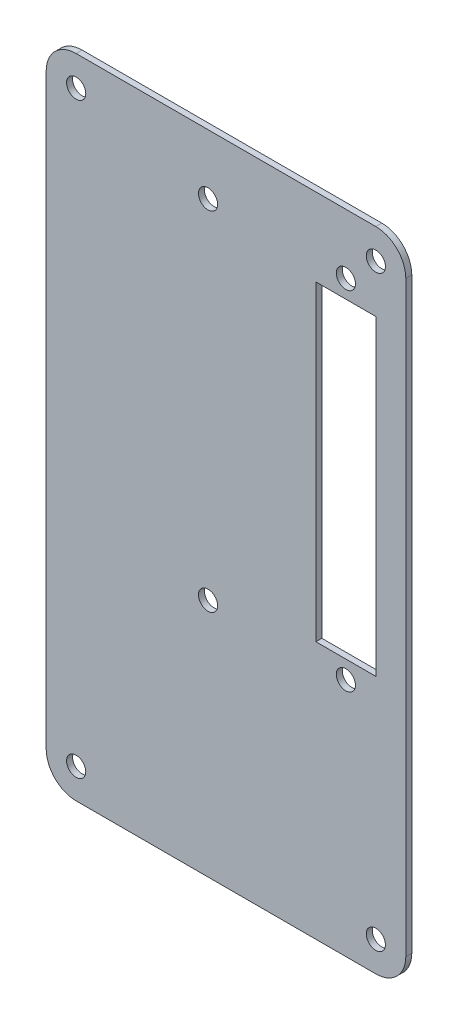
ISO-10303-21;
HEADER;
FILE_DESCRIPTION(('STEP AP214'),'2;1');
FILE_NAME('part.step','',(''),(''),'','','');
FILE_SCHEMA(('AUTOMOTIVE_DESIGN { 1 0 10303 214 1 1 1 1 }'));
ENDSEC;
DATA;
#1=APPLICATION_CONTEXT('core data for automotive mechanical design processes');
#2=APPLICATION_PROTOCOL_DEFINITION('international standard','automotive_design',2000,#1);
#3=PRODUCT_CONTEXT('',#1,'mechanical');
#4=PRODUCT('Part','Part','',(#3));
#5=PRODUCT_RELATED_PRODUCT_CATEGORY('part','',(#4));
#6=PRODUCT_DEFINITION_FORMATION('','',#4);
#7=PRODUCT_DEFINITION_CONTEXT('part definition',#1,'design');
#8=PRODUCT_DEFINITION('design','',#6,#7);
#9=PRODUCT_DEFINITION_SHAPE('','',#8);
#10=(LENGTH_UNIT() NAMED_UNIT(*) SI_UNIT(.MILLI.,.METRE.));
#11=(NAMED_UNIT(*) PLANE_ANGLE_UNIT() SI_UNIT($,.RADIAN.));
#12=(NAMED_UNIT(*) SI_UNIT($,.STERADIAN.) SOLID_ANGLE_UNIT());
#13=UNCERTAINTY_MEASURE_WITH_UNIT(LENGTH_MEASURE(1.E-05),#10,'distance_accuracy_value','');
#14=(GEOMETRIC_REPRESENTATION_CONTEXT(3) GLOBAL_UNCERTAINTY_ASSIGNED_CONTEXT((#13)) GLOBAL_UNIT_ASSIGNED_CONTEXT((#10,
#11,#12)) REPRESENTATION_CONTEXT('',''));
#15=CARTESIAN_POINT('',(0.,0.,0.));
#16=DIRECTION('',(0.,0.,1.));
#17=DIRECTION('',(1.,0.,0.));
#18=AXIS2_PLACEMENT_3D('',#15,#16,#17);
#19=CARTESIAN_POINT('',(30.,54.,1.));
#20=DIRECTION('',(-1.,0.,0.));
#21=DIRECTION('',(0.,-1.,0.));
#22=AXIS2_PLACEMENT_3D('',#19,#20,#21);
#23=PLANE('',#22);
#24=DIRECTION('',(0.,1.,0.));
#25=VECTOR('',#24,1.);
#26=CARTESIAN_POINT('',(30.,54.,1.));
#27=LINE('',#26,#25);
#28=CARTESIAN_POINT('',(30.,-49.,1.));
#29=VERTEX_POINT('',#28);
#30=CARTESIAN_POINT('',(30.,49.,1.));
#31=VERTEX_POINT('',#30);
#32=EDGE_CURVE('E191',#29,#31,#27,.T.);
#33=ORIENTED_EDGE('',*,*,#32,.F.);
#34=DIRECTION('',(0.,0.,-1.));
#35=VECTOR('',#34,1.);
#36=CARTESIAN_POINT('',(30.,-49.,1.));
#37=LINE('',#36,#35);
#38=CARTESIAN_POINT('',(30.,-49.,0.));
#39=VERTEX_POINT('',#38);
#40=EDGE_CURVE('E235',#29,#39,#37,.T.);
#41=ORIENTED_EDGE('',*,*,#40,.T.);
#42=DIRECTION('',(0.,1.,0.));
#43=VECTOR('',#42,1.);
#44=CARTESIAN_POINT('',(30.,54.,0.));
#45=LINE('',#44,#43);
#46=CARTESIAN_POINT('',(30.,49.,0.));
#47=VERTEX_POINT('',#46);
#48=EDGE_CURVE('E205',#39,#47,#45,.T.);
#49=ORIENTED_EDGE('',*,*,#48,.T.);
#50=DIRECTION('',(0.,0.,-1.));
#51=VECTOR('',#50,1.);
#52=CARTESIAN_POINT('',(30.,49.,1.));
#53=LINE('',#52,#51);
#54=EDGE_CURVE('E204',#47,#31,#53,.F.);
#55=ORIENTED_EDGE('',*,*,#54,.T.);
#56=EDGE_LOOP('',(#33,#41,#49,#55));
#57=FACE_BOUND('',#56,.T.);
#58=ADVANCED_FACE('F37',(#57),#23,.F.);
#59=CARTESIAN_POINT('',(-30.,54.,1.));
#60=DIRECTION('',(0.,-1.,0.));
#61=DIRECTION('',(0.,0.,-1.));
#62=AXIS2_PLACEMENT_3D('',#59,#60,#61);
#63=PLANE('',#62);
#64=DIRECTION('',(-1.,0.,0.));
#65=VECTOR('',#64,1.);
#66=CARTESIAN_POINT('',(-30.,54.,0.));
#67=LINE('',#66,#65);
#68=CARTESIAN_POINT('',(25.,54.,0.));
#69=VERTEX_POINT('',#68);
#70=CARTESIAN_POINT('',(-25.,54.,0.));
#71=VERTEX_POINT('',#70);
#72=EDGE_CURVE('E208',#69,#71,#67,.T.);
#73=ORIENTED_EDGE('',*,*,#72,.T.);
#74=DIRECTION('',(0.,0.,-1.));
#75=VECTOR('',#74,1.);
#76=CARTESIAN_POINT('',(-25.,54.,1.));
#77=LINE('',#76,#75);
#78=CARTESIAN_POINT('',(-25.,54.,1.));
#79=VERTEX_POINT('',#78);
#80=EDGE_CURVE('E11',#71,#79,#77,.F.);
#81=ORIENTED_EDGE('',*,*,#80,.T.);
#82=DIRECTION('',(-1.,0.,0.));
#83=VECTOR('',#82,1.);
#84=CARTESIAN_POINT('',(-30.,54.,1.));
#85=LINE('',#84,#83);
#86=CARTESIAN_POINT('',(25.,54.,1.));
#87=VERTEX_POINT('',#86);
#88=EDGE_CURVE('E194',#87,#79,#85,.T.);
#89=ORIENTED_EDGE('',*,*,#88,.F.);
#90=DIRECTION('',(0.,0.,-1.));
#91=VECTOR('',#90,1.);
#92=CARTESIAN_POINT('',(25.,54.,1.));
#93=LINE('',#92,#91);
#94=EDGE_CURVE('E45',#87,#69,#93,.T.);
#95=ORIENTED_EDGE('',*,*,#94,.T.);
#96=EDGE_LOOP('',(#73,#81,#89,#95));
#97=FACE_BOUND('',#96,.T.);
#98=ADVANCED_FACE('F268',(#97),#63,.F.);
#99=CARTESIAN_POINT('',(-30.,54.,1.));
#100=DIRECTION('',(1.,0.,0.));
#101=DIRECTION('',(0.,1.,0.));
#102=AXIS2_PLACEMENT_3D('',#99,#100,#101);
#103=PLANE('',#102);
#104=DIRECTION('',(0.,-1.,0.));
#105=VECTOR('',#104,1.);
#106=CARTESIAN_POINT('',(-30.,54.,0.));
#107=LINE('',#106,#105);
#108=CARTESIAN_POINT('',(-30.,49.,0.));
#109=VERTEX_POINT('',#108);
#110=CARTESIAN_POINT('',(-30.,-49.,0.));
#111=VERTEX_POINT('',#110);
#112=EDGE_CURVE('E211',#109,#111,#107,.T.);
#113=ORIENTED_EDGE('',*,*,#112,.T.);
#114=DIRECTION('',(0.,0.,-1.));
#115=VECTOR('',#114,1.);
#116=CARTESIAN_POINT('',(-30.,-49.,1.));
#117=LINE('',#116,#115);
#118=CARTESIAN_POINT('',(-30.,-49.,1.));
#119=VERTEX_POINT('',#118);
#120=EDGE_CURVE('E262',#111,#119,#117,.F.);
#121=ORIENTED_EDGE('',*,*,#120,.T.);
#122=DIRECTION('',(0.,-1.,0.));
#123=VECTOR('',#122,1.);
#124=CARTESIAN_POINT('',(-30.,54.,1.));
#125=LINE('',#124,#123);
#126=CARTESIAN_POINT('',(-30.,49.,1.));
#127=VERTEX_POINT('',#126);
#128=EDGE_CURVE('E198',#127,#119,#125,.T.);
#129=ORIENTED_EDGE('',*,*,#128,.F.);
#130=DIRECTION('',(0.,0.,-1.));
#131=VECTOR('',#130,1.);
#132=CARTESIAN_POINT('',(-30.,49.,1.));
#133=LINE('',#132,#131);
#134=EDGE_CURVE('E259',#127,#109,#133,.T.);
#135=ORIENTED_EDGE('',*,*,#134,.T.);
#136=EDGE_LOOP('',(#113,#121,#129,#135));
#137=FACE_BOUND('',#136,.T.);
#138=ADVANCED_FACE('F282',(#137),#103,.F.);
#139=CARTESIAN_POINT('',(-30.,-54.,1.));
#140=DIRECTION('',(0.,1.,0.));
#141=DIRECTION('',(0.,0.,1.));
#142=AXIS2_PLACEMENT_3D('',#139,#140,#141);
#143=PLANE('',#142);
#144=DIRECTION('',(1.,0.,0.));
#145=VECTOR('',#144,1.);
#146=CARTESIAN_POINT('',(-30.,-54.,0.));
#147=LINE('',#146,#145);
#148=CARTESIAN_POINT('',(-25.,-54.,0.));
#149=VERTEX_POINT('',#148);
#150=CARTESIAN_POINT('',(25.,-54.,0.));
#151=VERTEX_POINT('',#150);
#152=EDGE_CURVE('E195',#149,#151,#147,.T.);
#153=ORIENTED_EDGE('',*,*,#152,.T.);
#154=DIRECTION('',(0.,0.,-1.));
#155=VECTOR('',#154,1.);
#156=CARTESIAN_POINT('',(25.,-54.,1.));
#157=LINE('',#156,#155);
#158=CARTESIAN_POINT('',(25.,-54.,1.));
#159=VERTEX_POINT('',#158);
#160=EDGE_CURVE('E249',#151,#159,#157,.F.);
#161=ORIENTED_EDGE('',*,*,#160,.T.);
#162=DIRECTION('',(1.,0.,0.));
#163=VECTOR('',#162,1.);
#164=CARTESIAN_POINT('',(-30.,-54.,1.));
#165=LINE('',#164,#163);
#166=CARTESIAN_POINT('',(-25.,-54.,1.));
#167=VERTEX_POINT('',#166);
#168=EDGE_CURVE('E201',#167,#159,#165,.T.);
#169=ORIENTED_EDGE('',*,*,#168,.F.);
#170=DIRECTION('',(0.,0.,-1.));
#171=VECTOR('',#170,1.);
#172=CARTESIAN_POINT('',(-25.,-54.,1.));
#173=LINE('',#172,#171);
#174=EDGE_CURVE('E246',#167,#149,#173,.T.);
#175=ORIENTED_EDGE('',*,*,#174,.T.);
#176=EDGE_LOOP('',(#153,#161,#169,#175));
#177=FACE_BOUND('',#176,.T.);
#178=ADVANCED_FACE('F292',(#177),#143,.F.);
#179=CARTESIAN_POINT('',(0.,0.,1.));
#180=DIRECTION('',(0.,0.,1.));
#181=DIRECTION('',(1.,0.,0.));
#182=AXIS2_PLACEMENT_3D('',#179,#180,#181);
#183=PLANE('',#182);
#184=DIRECTION('',(0.,1.,0.));
#185=VECTOR('',#184,1.);
#186=CARTESIAN_POINT('',(15.,-11.,1.));
#187=LINE('',#186,#185);
#188=CARTESIAN_POINT('',(15.,-11.,1.));
#189=VERTEX_POINT('',#188);
#190=CARTESIAN_POINT('',(15.,41.,1.));
#191=VERTEX_POINT('',#190);
#192=EDGE_CURVE('E127',#189,#191,#187,.T.);
#193=ORIENTED_EDGE('',*,*,#192,.T.);
#194=DIRECTION('',(1.,0.,0.));
#195=VECTOR('',#194,1.);
#196=CARTESIAN_POINT('',(25.,41.,1.));
#197=LINE('',#196,#195);
#198=CARTESIAN_POINT('',(25.,41.,1.));
#199=VERTEX_POINT('',#198);
#200=EDGE_CURVE('E136',#191,#199,#197,.T.);
#201=ORIENTED_EDGE('',*,*,#200,.T.);
#202=DIRECTION('',(0.,-1.,0.));
#203=VECTOR('',#202,1.);
#204=CARTESIAN_POINT('',(25.,-11.,1.));
#205=LINE('',#204,#203);
#206=CARTESIAN_POINT('',(25.,-11.,1.));
#207=VERTEX_POINT('',#206);
#208=EDGE_CURVE('E52',#199,#207,#205,.T.);
#209=ORIENTED_EDGE('',*,*,#208,.T.);
#210=DIRECTION('',(-1.,0.,0.));
#211=VECTOR('',#210,1.);
#212=CARTESIAN_POINT('',(25.,-11.,1.));
#213=LINE('',#212,#211);
#214=EDGE_CURVE('E133',#207,#189,#213,.T.);
#215=ORIENTED_EDGE('',*,*,#214,.T.);
#216=EDGE_LOOP('',(#193,#201,#209,#215));
#217=FACE_BOUND('',#216,.T.);
#218=CARTESIAN_POINT('',(25.,49.,1.));
#219=DIRECTION('',(0.,0.,1.));
#220=DIRECTION('',(1.,0.,0.));
#221=AXIS2_PLACEMENT_3D('',#218,#219,#220);
#222=CIRCLE('',#221,1.6);
#223=CARTESIAN_POINT('',(26.6,49.,1.));
#224=VERTEX_POINT('',#223);
#225=EDGE_CURVE('E162',#224,#224,#222,.T.);
#226=ORIENTED_EDGE('',*,*,#225,.F.);
#227=EDGE_LOOP('',(#226));
#228=FACE_BOUND('',#227,.T.);
#229=CARTESIAN_POINT('',(-25.,-49.,1.));
#230=DIRECTION('',(0.,0.,1.));
#231=DIRECTION('',(1.,0.,0.));
#232=AXIS2_PLACEMENT_3D('',#229,#230,#231);
#233=CIRCLE('',#232,1.6);
#234=CARTESIAN_POINT('',(-23.4,-49.,1.));
#235=VERTEX_POINT('',#234);
#236=EDGE_CURVE('E166',#235,#235,#233,.T.);
#237=ORIENTED_EDGE('',*,*,#236,.F.);
#238=EDGE_LOOP('',(#237));
#239=FACE_BOUND('',#238,.T.);
#240=CARTESIAN_POINT('',(25.,-49.,1.));
#241=DIRECTION('',(0.,0.,1.));
#242=DIRECTION('',(1.,0.,0.));
#243=AXIS2_PLACEMENT_3D('',#240,#241,#242);
#244=CIRCLE('',#243,1.6);
#245=CARTESIAN_POINT('',(26.6,-49.,1.));
#246=VERTEX_POINT('',#245);
#247=EDGE_CURVE('E158',#246,#246,#244,.T.);
#248=ORIENTED_EDGE('',*,*,#247,.F.);
#249=EDGE_LOOP('',(#248));
#250=FACE_BOUND('',#249,.T.);
#251=CARTESIAN_POINT('',(-25.,49.,1.));
#252=DIRECTION('',(0.,0.,1.));
#253=DIRECTION('',(1.,0.,0.));
#254=AXIS2_PLACEMENT_3D('',#251,#252,#253);
#255=CIRCLE('',#254,1.6);
#256=CARTESIAN_POINT('',(-23.4,49.,1.));
#257=VERTEX_POINT('',#256);
#258=EDGE_CURVE('E171',#257,#257,#255,.T.);
#259=ORIENTED_EDGE('',*,*,#258,.F.);
#260=EDGE_LOOP('',(#259));
#261=FACE_BOUND('',#260,.T.);
#262=CARTESIAN_POINT('',(20.,44.,1.));
#263=DIRECTION('',(0.,0.,1.));
#264=DIRECTION('',(1.,0.,0.));
#265=AXIS2_PLACEMENT_3D('',#262,#263,#264);
#266=CIRCLE('',#265,1.6);
#267=CARTESIAN_POINT('',(21.6,44.,1.));
#268=VERTEX_POINT('',#267);
#269=EDGE_CURVE('E176',#268,#268,#266,.T.);
#270=ORIENTED_EDGE('',*,*,#269,.F.);
#271=EDGE_LOOP('',(#270));
#272=FACE_BOUND('',#271,.T.);
#273=CARTESIAN_POINT('',(-2.99999999999999,-14.,1.));
#274=DIRECTION('',(0.,0.,1.));
#275=DIRECTION('',(1.,0.,0.));
#276=AXIS2_PLACEMENT_3D('',#273,#274,#275);
#277=CIRCLE('',#276,1.6);
#278=CARTESIAN_POINT('',(-1.39999999999999,-14.,1.));
#279=VERTEX_POINT('',#278);
#280=EDGE_CURVE('E180',#279,#279,#277,.T.);
#281=ORIENTED_EDGE('',*,*,#280,.F.);
#282=EDGE_LOOP('',(#281));
#283=FACE_BOUND('',#282,.T.);
#284=CARTESIAN_POINT('',(20.,-14.,1.));
#285=DIRECTION('',(0.,0.,1.));
#286=DIRECTION('',(1.,0.,0.));
#287=AXIS2_PLACEMENT_3D('',#284,#285,#286);
#288=CIRCLE('',#287,1.6);
#289=CARTESIAN_POINT('',(21.6,-14.,1.));
#290=VERTEX_POINT('',#289);
#291=EDGE_CURVE('E183',#290,#290,#288,.T.);
#292=ORIENTED_EDGE('',*,*,#291,.F.);
#293=EDGE_LOOP('',(#292));
#294=FACE_BOUND('',#293,.T.);
#295=CARTESIAN_POINT('',(-3.,44.,1.));
#296=DIRECTION('',(0.,0.,1.));
#297=DIRECTION('',(1.,0.,0.));
#298=AXIS2_PLACEMENT_3D('',#295,#296,#297);
#299=CIRCLE('',#298,1.6);
#300=CARTESIAN_POINT('',(-1.4,44.,1.));
#301=VERTEX_POINT('',#300);
#302=EDGE_CURVE('E186',#301,#301,#299,.T.);
#303=ORIENTED_EDGE('',*,*,#302,.F.);
#304=EDGE_LOOP('',(#303));
#305=FACE_BOUND('',#304,.T.);
#306=ORIENTED_EDGE('',*,*,#168,.T.);
#307=CARTESIAN_POINT('',(25.,-49.,1.));
#308=DIRECTION('',(0.,0.,1.));
#309=DIRECTION('',(1.,0.,0.));
#310=AXIS2_PLACEMENT_3D('',#307,#308,#309);
#311=CIRCLE('',#310,5.);
#312=EDGE_CURVE('E257',#159,#29,#311,.T.);
#313=ORIENTED_EDGE('',*,*,#312,.T.);
#314=ORIENTED_EDGE('',*,*,#32,.T.);
#315=CARTESIAN_POINT('',(25.,49.,1.));
#316=DIRECTION('',(0.,0.,1.));
#317=DIRECTION('',(1.,0.,0.));
#318=AXIS2_PLACEMENT_3D('',#315,#316,#317);
#319=CIRCLE('',#318,5.);
#320=EDGE_CURVE('E251',#31,#87,#319,.T.);
#321=ORIENTED_EDGE('',*,*,#320,.T.);
#322=ORIENTED_EDGE('',*,*,#88,.T.);
#323=CARTESIAN_POINT('',(-25.,49.,1.));
#324=DIRECTION('',(0.,0.,1.));
#325=DIRECTION('',(1.,0.,0.));
#326=AXIS2_PLACEMENT_3D('',#323,#324,#325);
#327=CIRCLE('',#326,5.);
#328=EDGE_CURVE('E253',#79,#127,#327,.T.);
#329=ORIENTED_EDGE('',*,*,#328,.T.);
#330=ORIENTED_EDGE('',*,*,#128,.T.);
#331=CARTESIAN_POINT('',(-25.,-49.,1.));
#332=DIRECTION('',(0.,0.,1.));
#333=DIRECTION('',(1.,0.,0.));
#334=AXIS2_PLACEMENT_3D('',#331,#332,#333);
#335=CIRCLE('',#334,5.);
#336=EDGE_CURVE('E255',#119,#167,#335,.T.);
#337=ORIENTED_EDGE('',*,*,#336,.T.);
#338=EDGE_LOOP('',(#306,#313,#314,#321,#322,#329,#330,#337));
#339=FACE_BOUND('',#338,.T.);
#340=ADVANCED_FACE('F140',(#217,#228,#239,#250,#261,#272,#283,#294,#305,#339),#183,.T.);
#341=CARTESIAN_POINT('',(0.,0.,0.));
#342=DIRECTION('',(0.,0.,1.));
#343=DIRECTION('',(1.,0.,0.));
#344=AXIS2_PLACEMENT_3D('',#341,#342,#343);
#345=PLANE('',#344);
#346=DIRECTION('',(1.,0.,0.));
#347=VECTOR('',#346,1.);
#348=CARTESIAN_POINT('',(25.,41.,0.));
#349=LINE('',#348,#347);
#350=CARTESIAN_POINT('',(15.,41.,0.));
#351=VERTEX_POINT('',#350);
#352=CARTESIAN_POINT('',(25.,41.,0.));
#353=VERTEX_POINT('',#352);
#354=EDGE_CURVE('E152',#351,#353,#349,.T.);
#355=ORIENTED_EDGE('',*,*,#354,.F.);
#356=DIRECTION('',(0.,1.,0.));
#357=VECTOR('',#356,1.);
#358=CARTESIAN_POINT('',(15.,-11.,0.));
#359=LINE('',#358,#357);
#360=CARTESIAN_POINT('',(15.,-11.,0.));
#361=VERTEX_POINT('',#360);
#362=EDGE_CURVE('E60',#361,#351,#359,.T.);
#363=ORIENTED_EDGE('',*,*,#362,.F.);
#364=DIRECTION('',(-1.,0.,0.));
#365=VECTOR('',#364,1.);
#366=CARTESIAN_POINT('',(25.,-11.,0.));
#367=LINE('',#366,#365);
#368=CARTESIAN_POINT('',(25.,-11.,0.));
#369=VERTEX_POINT('',#368);
#370=EDGE_CURVE('E143',#369,#361,#367,.T.);
#371=ORIENTED_EDGE('',*,*,#370,.F.);
#372=DIRECTION('',(0.,-1.,0.));
#373=VECTOR('',#372,1.);
#374=CARTESIAN_POINT('',(25.,-11.,0.));
#375=LINE('',#374,#373);
#376=EDGE_CURVE('E146',#353,#369,#375,.T.);
#377=ORIENTED_EDGE('',*,*,#376,.F.);
#378=EDGE_LOOP('',(#355,#363,#371,#377));
#379=FACE_BOUND('',#378,.T.);
#380=CARTESIAN_POINT('',(25.,49.,0.));
#381=DIRECTION('',(0.,0.,1.));
#382=DIRECTION('',(1.,0.,0.));
#383=AXIS2_PLACEMENT_3D('',#380,#381,#382);
#384=CIRCLE('',#383,1.6);
#385=CARTESIAN_POINT('',(26.6,49.,0.));
#386=VERTEX_POINT('',#385);
#387=EDGE_CURVE('E175',#386,#386,#384,.T.);
#388=ORIENTED_EDGE('',*,*,#387,.T.);
#389=EDGE_LOOP('',(#388));
#390=FACE_BOUND('',#389,.T.);
#391=CARTESIAN_POINT('',(-25.,-49.,0.));
#392=DIRECTION('',(0.,0.,1.));
#393=DIRECTION('',(1.,0.,0.));
#394=AXIS2_PLACEMENT_3D('',#391,#392,#393);
#395=CIRCLE('',#394,1.6);
#396=CARTESIAN_POINT('',(-23.4,-49.,0.));
#397=VERTEX_POINT('',#396);
#398=EDGE_CURVE('E229',#397,#397,#395,.T.);
#399=ORIENTED_EDGE('',*,*,#398,.T.);
#400=EDGE_LOOP('',(#399));
#401=FACE_BOUND('',#400,.T.);
#402=CARTESIAN_POINT('',(25.,-49.,0.));
#403=DIRECTION('',(0.,0.,1.));
#404=DIRECTION('',(1.,0.,0.));
#405=AXIS2_PLACEMENT_3D('',#402,#403,#404);
#406=CIRCLE('',#405,1.6);
#407=CARTESIAN_POINT('',(26.6,-49.,0.));
#408=VERTEX_POINT('',#407);
#409=EDGE_CURVE('E165',#408,#408,#406,.T.);
#410=ORIENTED_EDGE('',*,*,#409,.T.);
#411=EDGE_LOOP('',(#410));
#412=FACE_BOUND('',#411,.T.);
#413=CARTESIAN_POINT('',(-25.,49.,0.));
#414=DIRECTION('',(0.,0.,1.));
#415=DIRECTION('',(1.,0.,0.));
#416=AXIS2_PLACEMENT_3D('',#413,#414,#415);
#417=CIRCLE('',#416,1.6);
#418=CARTESIAN_POINT('',(-23.4,49.,0.));
#419=VERTEX_POINT('',#418);
#420=EDGE_CURVE('E174',#419,#419,#417,.T.);
#421=ORIENTED_EDGE('',*,*,#420,.T.);
#422=EDGE_LOOP('',(#421));
#423=FACE_BOUND('',#422,.T.);
#424=CARTESIAN_POINT('',(20.,44.,0.));
#425=DIRECTION('',(0.,0.,1.));
#426=DIRECTION('',(1.,0.,0.));
#427=AXIS2_PLACEMENT_3D('',#424,#425,#426);
#428=CIRCLE('',#427,1.6);
#429=CARTESIAN_POINT('',(21.6,44.,0.));
#430=VERTEX_POINT('',#429);
#431=EDGE_CURVE('E190',#430,#430,#428,.T.);
#432=ORIENTED_EDGE('',*,*,#431,.T.);
#433=EDGE_LOOP('',(#432));
#434=FACE_BOUND('',#433,.T.);
#435=CARTESIAN_POINT('',(-2.99999999999999,-14.,0.));
#436=DIRECTION('',(0.,0.,1.));
#437=DIRECTION('',(1.,0.,0.));
#438=AXIS2_PLACEMENT_3D('',#435,#436,#437);
#439=CIRCLE('',#438,1.6);
#440=CARTESIAN_POINT('',(-1.39999999999999,-14.,0.));
#441=VERTEX_POINT('',#440);
#442=EDGE_CURVE('E220',#441,#441,#439,.T.);
#443=ORIENTED_EDGE('',*,*,#442,.T.);
#444=EDGE_LOOP('',(#443));
#445=FACE_BOUND('',#444,.T.);
#446=CARTESIAN_POINT('',(20.,-14.,0.));
#447=DIRECTION('',(0.,0.,1.));
#448=DIRECTION('',(1.,0.,0.));
#449=AXIS2_PLACEMENT_3D('',#446,#447,#448);
#450=CIRCLE('',#449,1.6);
#451=CARTESIAN_POINT('',(21.6,-14.,0.));
#452=VERTEX_POINT('',#451);
#453=EDGE_CURVE('E179',#452,#452,#450,.T.);
#454=ORIENTED_EDGE('',*,*,#453,.T.);
#455=EDGE_LOOP('',(#454));
#456=FACE_BOUND('',#455,.T.);
#457=CARTESIAN_POINT('',(-3.,44.,0.));
#458=DIRECTION('',(0.,0.,1.));
#459=DIRECTION('',(1.,0.,0.));
#460=AXIS2_PLACEMENT_3D('',#457,#458,#459);
#461=CIRCLE('',#460,1.6);
#462=CARTESIAN_POINT('',(-1.4,44.,0.));
#463=VERTEX_POINT('',#462);
#464=EDGE_CURVE('E189',#463,#463,#461,.T.);
#465=ORIENTED_EDGE('',*,*,#464,.T.);
#466=EDGE_LOOP('',(#465));
#467=FACE_BOUND('',#466,.T.);
#468=ORIENTED_EDGE('',*,*,#48,.F.);
#469=CARTESIAN_POINT('',(25.,-49.,0.));
#470=DIRECTION('',(0.,0.,1.));
#471=DIRECTION('',(1.,0.,0.));
#472=AXIS2_PLACEMENT_3D('',#469,#470,#471);
#473=CIRCLE('',#472,5.);
#474=EDGE_CURVE('E244',#39,#151,#473,.F.);
#475=ORIENTED_EDGE('',*,*,#474,.T.);
#476=ORIENTED_EDGE('',*,*,#152,.F.);
#477=CARTESIAN_POINT('',(-25.,-49.,0.));
#478=DIRECTION('',(0.,0.,1.));
#479=DIRECTION('',(1.,0.,0.));
#480=AXIS2_PLACEMENT_3D('',#477,#478,#479);
#481=CIRCLE('',#480,5.);
#482=EDGE_CURVE('E242',#149,#111,#481,.F.);
#483=ORIENTED_EDGE('',*,*,#482,.T.);
#484=ORIENTED_EDGE('',*,*,#112,.F.);
#485=CARTESIAN_POINT('',(-25.,49.,0.));
#486=DIRECTION('',(0.,0.,1.));
#487=DIRECTION('',(1.,0.,0.));
#488=AXIS2_PLACEMENT_3D('',#485,#486,#487);
#489=CIRCLE('',#488,5.);
#490=EDGE_CURVE('E240',#109,#71,#489,.F.);
#491=ORIENTED_EDGE('',*,*,#490,.T.);
#492=ORIENTED_EDGE('',*,*,#72,.F.);
#493=CARTESIAN_POINT('',(25.,49.,0.));
#494=DIRECTION('',(0.,0.,1.));
#495=DIRECTION('',(1.,0.,0.));
#496=AXIS2_PLACEMENT_3D('',#493,#494,#495);
#497=CIRCLE('',#496,5.);
#498=EDGE_CURVE('E238',#69,#47,#497,.F.);
#499=ORIENTED_EDGE('',*,*,#498,.T.);
#500=EDGE_LOOP('',(#468,#475,#476,#483,#484,#491,#492,#499));
#501=FACE_BOUND('',#500,.T.);
#502=ADVANCED_FACE('F274',(#379,#390,#401,#412,#423,#434,#445,#456,#467,#501),#345,.F.);
#503=CARTESIAN_POINT('',(-3.,44.,-4.));
#504=DIRECTION('',(0.,0.,1.));
#505=DIRECTION('',(1.,0.,0.));
#506=AXIS2_PLACEMENT_3D('',#503,#504,#505);
#507=CYLINDRICAL_SURFACE('',#506,1.6);
#508=ORIENTED_EDGE('',*,*,#302,.T.);
#509=EDGE_LOOP('',(#508));
#510=FACE_BOUND('',#509,.T.);
#511=ORIENTED_EDGE('',*,*,#464,.F.);
#512=EDGE_LOOP('',(#511));
#513=FACE_BOUND('',#512,.T.);
#514=ADVANCED_FACE('F353',(#510,#513),#507,.F.);
#515=CARTESIAN_POINT('',(20.,-14.,-4.));
#516=DIRECTION('',(0.,0.,1.));
#517=DIRECTION('',(1.,0.,0.));
#518=AXIS2_PLACEMENT_3D('',#515,#516,#517);
#519=CYLINDRICAL_SURFACE('',#518,1.6);
#520=ORIENTED_EDGE('',*,*,#291,.T.);
#521=EDGE_LOOP('',(#520));
#522=FACE_BOUND('',#521,.T.);
#523=ORIENTED_EDGE('',*,*,#453,.F.);
#524=EDGE_LOOP('',(#523));
#525=FACE_BOUND('',#524,.T.);
#526=ADVANCED_FACE('F413',(#522,#525),#519,.F.);
#527=CARTESIAN_POINT('',(-2.99999999999999,-14.,-4.));
#528=DIRECTION('',(0.,0.,1.));
#529=DIRECTION('',(1.,0.,0.));
#530=AXIS2_PLACEMENT_3D('',#527,#528,#529);
#531=CYLINDRICAL_SURFACE('',#530,1.6);
#532=ORIENTED_EDGE('',*,*,#280,.T.);
#533=EDGE_LOOP('',(#532));
#534=FACE_BOUND('',#533,.T.);
#535=ORIENTED_EDGE('',*,*,#442,.F.);
#536=EDGE_LOOP('',(#535));
#537=FACE_BOUND('',#536,.T.);
#538=ADVANCED_FACE('F409',(#534,#537),#531,.F.);
#539=CARTESIAN_POINT('',(20.,44.,-4.));
#540=DIRECTION('',(0.,0.,1.));
#541=DIRECTION('',(1.,0.,0.));
#542=AXIS2_PLACEMENT_3D('',#539,#540,#541);
#543=CYLINDRICAL_SURFACE('',#542,1.6);
#544=ORIENTED_EDGE('',*,*,#269,.T.);
#545=EDGE_LOOP('',(#544));
#546=FACE_BOUND('',#545,.T.);
#547=ORIENTED_EDGE('',*,*,#431,.F.);
#548=EDGE_LOOP('',(#547));
#549=FACE_BOUND('',#548,.T.);
#550=ADVANCED_FACE('F405',(#546,#549),#543,.F.);
#551=CARTESIAN_POINT('',(-25.,49.,-4.));
#552=DIRECTION('',(0.,0.,1.));
#553=DIRECTION('',(1.,0.,0.));
#554=AXIS2_PLACEMENT_3D('',#551,#552,#553);
#555=CYLINDRICAL_SURFACE('',#554,1.6);
#556=ORIENTED_EDGE('',*,*,#258,.T.);
#557=EDGE_LOOP('',(#556));
#558=FACE_BOUND('',#557,.T.);
#559=ORIENTED_EDGE('',*,*,#420,.F.);
#560=EDGE_LOOP('',(#559));
#561=FACE_BOUND('',#560,.T.);
#562=ADVANCED_FACE('F401',(#558,#561),#555,.F.);
#563=CARTESIAN_POINT('',(25.,-49.,-4.));
#564=DIRECTION('',(0.,0.,1.));
#565=DIRECTION('',(1.,0.,0.));
#566=AXIS2_PLACEMENT_3D('',#563,#564,#565);
#567=CYLINDRICAL_SURFACE('',#566,1.6);
#568=ORIENTED_EDGE('',*,*,#247,.T.);
#569=EDGE_LOOP('',(#568));
#570=FACE_BOUND('',#569,.T.);
#571=ORIENTED_EDGE('',*,*,#409,.F.);
#572=EDGE_LOOP('',(#571));
#573=FACE_BOUND('',#572,.T.);
#574=ADVANCED_FACE('F397',(#570,#573),#567,.F.);
#575=CARTESIAN_POINT('',(-25.,-49.,-4.));
#576=DIRECTION('',(0.,0.,1.));
#577=DIRECTION('',(1.,0.,0.));
#578=AXIS2_PLACEMENT_3D('',#575,#576,#577);
#579=CYLINDRICAL_SURFACE('',#578,1.6);
#580=ORIENTED_EDGE('',*,*,#236,.T.);
#581=EDGE_LOOP('',(#580));
#582=FACE_BOUND('',#581,.T.);
#583=ORIENTED_EDGE('',*,*,#398,.F.);
#584=EDGE_LOOP('',(#583));
#585=FACE_BOUND('',#584,.T.);
#586=ADVANCED_FACE('F393',(#582,#585),#579,.F.);
#587=CARTESIAN_POINT('',(25.,49.,-4.));
#588=DIRECTION('',(0.,0.,1.));
#589=DIRECTION('',(1.,0.,0.));
#590=AXIS2_PLACEMENT_3D('',#587,#588,#589);
#591=CYLINDRICAL_SURFACE('',#590,1.6);
#592=ORIENTED_EDGE('',*,*,#225,.T.);
#593=EDGE_LOOP('',(#592));
#594=FACE_BOUND('',#593,.T.);
#595=ORIENTED_EDGE('',*,*,#387,.F.);
#596=EDGE_LOOP('',(#595));
#597=FACE_BOUND('',#596,.T.);
#598=ADVANCED_FACE('F318',(#594,#597),#591,.F.);
#599=CARTESIAN_POINT('',(25.,-49.,1.));
#600=DIRECTION('',(0.,0.,-1.));
#601=DIRECTION('',(-1.,0.,0.));
#602=AXIS2_PLACEMENT_3D('',#599,#600,#601);
#603=CYLINDRICAL_SURFACE('',#602,5.);
#604=ORIENTED_EDGE('',*,*,#312,.F.);
#605=ORIENTED_EDGE('',*,*,#160,.F.);
#606=ORIENTED_EDGE('',*,*,#474,.F.);
#607=ORIENTED_EDGE('',*,*,#40,.F.);
#608=EDGE_LOOP('',(#604,#605,#606,#607));
#609=FACE_BOUND('',#608,.T.);
#610=ADVANCED_FACE('F297',(#609),#603,.T.);
#611=CARTESIAN_POINT('',(-25.,-49.,1.));
#612=DIRECTION('',(0.,0.,-1.));
#613=DIRECTION('',(-1.,0.,0.));
#614=AXIS2_PLACEMENT_3D('',#611,#612,#613);
#615=CYLINDRICAL_SURFACE('',#614,5.);
#616=ORIENTED_EDGE('',*,*,#336,.F.);
#617=ORIENTED_EDGE('',*,*,#120,.F.);
#618=ORIENTED_EDGE('',*,*,#482,.F.);
#619=ORIENTED_EDGE('',*,*,#174,.F.);
#620=EDGE_LOOP('',(#616,#617,#618,#619));
#621=FACE_BOUND('',#620,.T.);
#622=ADVANCED_FACE('F289',(#621),#615,.T.);
#623=CARTESIAN_POINT('',(-25.,49.,1.));
#624=DIRECTION('',(0.,0.,-1.));
#625=DIRECTION('',(-1.,0.,0.));
#626=AXIS2_PLACEMENT_3D('',#623,#624,#625);
#627=CYLINDRICAL_SURFACE('',#626,5.);
#628=ORIENTED_EDGE('',*,*,#328,.F.);
#629=ORIENTED_EDGE('',*,*,#80,.F.);
#630=ORIENTED_EDGE('',*,*,#490,.F.);
#631=ORIENTED_EDGE('',*,*,#134,.F.);
#632=EDGE_LOOP('',(#628,#629,#630,#631));
#633=FACE_BOUND('',#632,.T.);
#634=ADVANCED_FACE('F279',(#633),#627,.T.);
#635=CARTESIAN_POINT('',(25.,49.,1.));
#636=DIRECTION('',(0.,0.,-1.));
#637=DIRECTION('',(-1.,0.,0.));
#638=AXIS2_PLACEMENT_3D('',#635,#636,#637);
#639=CYLINDRICAL_SURFACE('',#638,5.);
#640=ORIENTED_EDGE('',*,*,#320,.F.);
#641=ORIENTED_EDGE('',*,*,#54,.F.);
#642=ORIENTED_EDGE('',*,*,#498,.F.);
#643=ORIENTED_EDGE('',*,*,#94,.F.);
#644=EDGE_LOOP('',(#640,#641,#642,#643));
#645=FACE_BOUND('',#644,.T.);
#646=ADVANCED_FACE('F39',(#645),#639,.T.);
#647=CARTESIAN_POINT('',(15.,-11.,1.));
#648=DIRECTION('',(-1.,0.,0.));
#649=DIRECTION('',(0.,0.,1.));
#650=AXIS2_PLACEMENT_3D('',#647,#648,#649);
#651=PLANE('',#650);
#652=ORIENTED_EDGE('',*,*,#362,.T.);
#653=DIRECTION('',(0.,0.,-1.));
#654=VECTOR('',#653,1.);
#655=CARTESIAN_POINT('',(15.,41.,1.));
#656=LINE('',#655,#654);
#657=EDGE_CURVE('E123',#191,#351,#656,.T.);
#658=ORIENTED_EDGE('',*,*,#657,.F.);
#659=ORIENTED_EDGE('',*,*,#192,.F.);
#660=DIRECTION('',(0.,0.,-1.));
#661=VECTOR('',#660,1.);
#662=CARTESIAN_POINT('',(15.,-11.,1.));
#663=LINE('',#662,#661);
#664=EDGE_CURVE('E156',#189,#361,#663,.T.);
#665=ORIENTED_EDGE('',*,*,#664,.T.);
#666=EDGE_LOOP('',(#652,#658,#659,#665));
#667=FACE_BOUND('',#666,.T.);
#668=ADVANCED_FACE('F125',(#667),#651,.F.);
#669=CARTESIAN_POINT('',(25.,-11.,1.));
#670=DIRECTION('',(0.,-1.,0.));
#671=DIRECTION('',(0.,0.,-1.));
#672=AXIS2_PLACEMENT_3D('',#669,#670,#671);
#673=PLANE('',#672);
#674=ORIENTED_EDGE('',*,*,#370,.T.);
#675=ORIENTED_EDGE('',*,*,#664,.F.);
#676=ORIENTED_EDGE('',*,*,#214,.F.);
#677=DIRECTION('',(0.,0.,-1.));
#678=VECTOR('',#677,1.);
#679=CARTESIAN_POINT('',(25.,-11.,1.));
#680=LINE('',#679,#678);
#681=EDGE_CURVE('E159',#207,#369,#680,.T.);
#682=ORIENTED_EDGE('',*,*,#681,.T.);
#683=EDGE_LOOP('',(#674,#675,#676,#682));
#684=FACE_BOUND('',#683,.T.);
#685=ADVANCED_FACE('F306',(#684),#673,.F.);
#686=CARTESIAN_POINT('',(25.,-11.,1.));
#687=DIRECTION('',(1.,0.,0.));
#688=DIRECTION('',(0.,0.,-1.));
#689=AXIS2_PLACEMENT_3D('',#686,#687,#688);
#690=PLANE('',#689);
#691=ORIENTED_EDGE('',*,*,#376,.T.);
#692=ORIENTED_EDGE('',*,*,#681,.F.);
#693=ORIENTED_EDGE('',*,*,#208,.F.);
#694=DIRECTION('',(0.,0.,-1.));
#695=VECTOR('',#694,1.);
#696=CARTESIAN_POINT('',(25.,41.,1.));
#697=LINE('',#696,#695);
#698=EDGE_CURVE('E132',#199,#353,#697,.T.);
#699=ORIENTED_EDGE('',*,*,#698,.T.);
#700=EDGE_LOOP('',(#691,#692,#693,#699));
#701=FACE_BOUND('',#700,.T.);
#702=ADVANCED_FACE('F370',(#701),#690,.F.);
#703=CARTESIAN_POINT('',(25.,41.,1.));
#704=DIRECTION('',(0.,1.,0.));
#705=DIRECTION('',(-1.,0.,0.));
#706=AXIS2_PLACEMENT_3D('',#703,#704,#705);
#707=PLANE('',#706);
#708=ORIENTED_EDGE('',*,*,#354,.T.);
#709=ORIENTED_EDGE('',*,*,#698,.F.);
#710=ORIENTED_EDGE('',*,*,#200,.F.);
#711=ORIENTED_EDGE('',*,*,#657,.T.);
#712=EDGE_LOOP('',(#708,#709,#710,#711));
#713=FACE_BOUND('',#712,.T.);
#714=ADVANCED_FACE('F137',(#713),#707,.F.);
#715=CLOSED_SHELL('',(#58,#98,#138,#178,#340,#502,#514,#526,#538,#550,#562,#574,#586,#598,#610,
#622,#634,#646,#668,#685,#702,#714));
#716=MANIFOLD_SOLID_BREP('B2',#715);
#717=ADVANCED_BREP_SHAPE_REPRESENTATION('',(#18,#716),#14);
#718=SHAPE_DEFINITION_REPRESENTATION(#9,#717);
ENDSEC;
END-ISO-10303-21;
